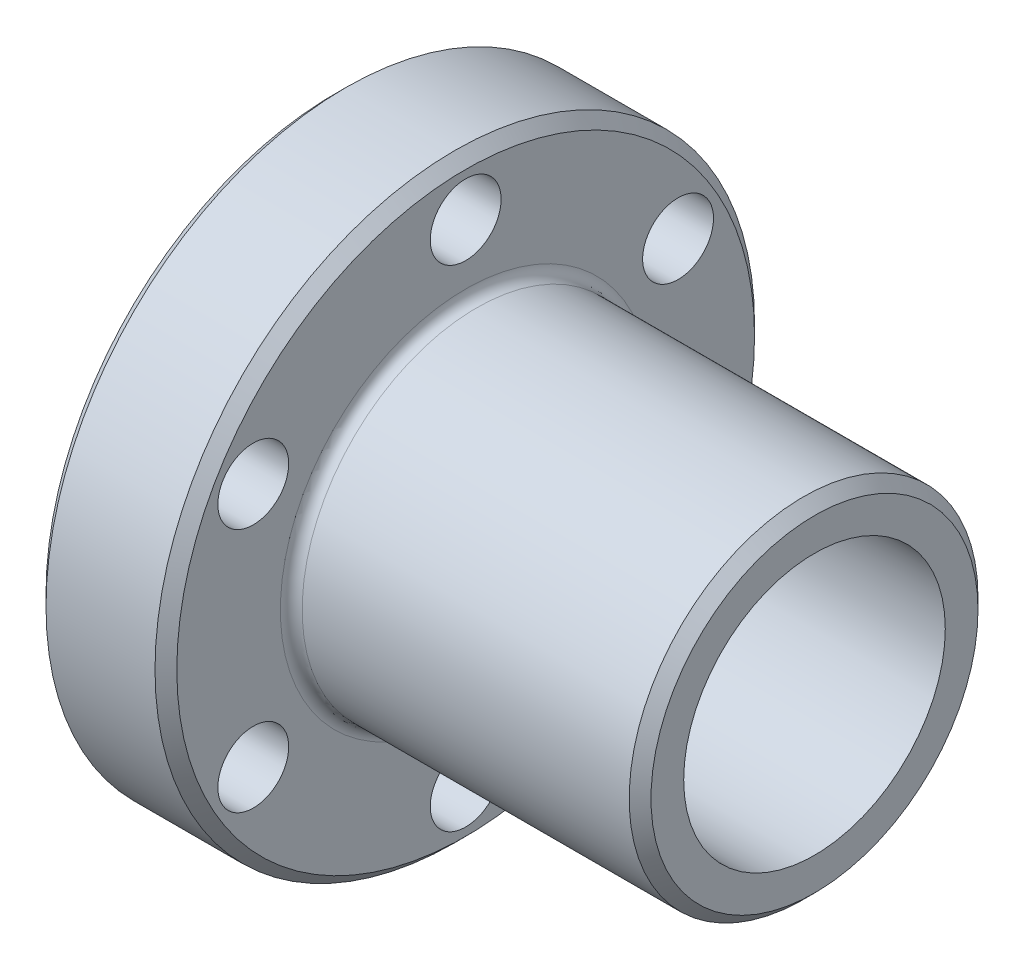
ISO-10303-21;
HEADER;
FILE_DESCRIPTION(('STEP AP214'),'2;1');
FILE_NAME('part.step','',(''),(''),'','','');
FILE_SCHEMA(('AUTOMOTIVE_DESIGN { 1 0 10303 214 1 1 1 1 }'));
ENDSEC;
DATA;
#1=APPLICATION_CONTEXT('core data for automotive mechanical design processes');
#2=APPLICATION_PROTOCOL_DEFINITION('international standard','automotive_design',2000,#1);
#3=PRODUCT_CONTEXT('',#1,'mechanical');
#4=PRODUCT('Part','Part','',(#3));
#5=PRODUCT_RELATED_PRODUCT_CATEGORY('part','',(#4));
#6=PRODUCT_DEFINITION_FORMATION('','',#4);
#7=PRODUCT_DEFINITION_CONTEXT('part definition',#1,'design');
#8=PRODUCT_DEFINITION('design','',#6,#7);
#9=PRODUCT_DEFINITION_SHAPE('','',#8);
#10=(LENGTH_UNIT() NAMED_UNIT(*) SI_UNIT(.MILLI.,.METRE.));
#11=(NAMED_UNIT(*) PLANE_ANGLE_UNIT() SI_UNIT($,.RADIAN.));
#12=(NAMED_UNIT(*) SI_UNIT($,.STERADIAN.) SOLID_ANGLE_UNIT());
#13=UNCERTAINTY_MEASURE_WITH_UNIT(LENGTH_MEASURE(1.E-05),#10,'distance_accuracy_value','');
#14=(GEOMETRIC_REPRESENTATION_CONTEXT(3) GLOBAL_UNCERTAINTY_ASSIGNED_CONTEXT((#13)) GLOBAL_UNIT_ASSIGNED_CONTEXT((#10,
#11,#12)) REPRESENTATION_CONTEXT('',''));
#15=CARTESIAN_POINT('',(0.,0.,0.));
#16=DIRECTION('',(0.,0.,1.));
#17=DIRECTION('',(1.,0.,0.));
#18=AXIS2_PLACEMENT_3D('',#15,#16,#17);
#19=CARTESIAN_POINT('',(1.,0.,0.));
#20=DIRECTION('',(1.,0.,0.));
#21=DIRECTION('',(0.,0.,-1.));
#22=AXIS2_PLACEMENT_3D('',#19,#20,#21);
#23=CONICAL_SURFACE('',#22,27.5,0.785398163397448);
#24=CARTESIAN_POINT('',(0.,0.,0.));
#25=DIRECTION('',(1.,0.,0.));
#26=DIRECTION('',(0.,0.,-1.));
#27=AXIS2_PLACEMENT_3D('',#24,#25,#26);
#28=CIRCLE('',#27,26.5);
#29=CARTESIAN_POINT('',(0.,0.,-26.5));
#30=VERTEX_POINT('',#29);
#31=EDGE_CURVE('E108',#30,#30,#28,.T.);
#32=ORIENTED_EDGE('',*,*,#31,.T.);
#33=EDGE_LOOP('',(#32));
#34=FACE_BOUND('',#33,.T.);
#35=CARTESIAN_POINT('',(1.,0.,0.));
#36=DIRECTION('',(1.,0.,0.));
#37=DIRECTION('',(0.,0.,-1.));
#38=AXIS2_PLACEMENT_3D('',#35,#36,#37);
#39=CIRCLE('',#38,27.5);
#40=CARTESIAN_POINT('',(1.,0.,-27.5));
#41=VERTEX_POINT('',#40);
#42=EDGE_CURVE('E104',#41,#41,#39,.T.);
#43=ORIENTED_EDGE('',*,*,#42,.F.);
#44=EDGE_LOOP('',(#43));
#45=FACE_BOUND('',#44,.T.);
#46=ADVANCED_FACE('F15',(#34,#45),#23,.T.);
#47=CARTESIAN_POINT('',(0.,26.5,0.));
#48=DIRECTION('',(-1.,0.,0.));
#49=DIRECTION('',(0.,0.,1.));
#50=AXIS2_PLACEMENT_3D('',#47,#48,#49);
#51=PLANE('',#50);
#52=CARTESIAN_POINT('',(0.,0.,0.));
#53=DIRECTION('',(1.,0.,0.));
#54=DIRECTION('',(0.,0.,-1.));
#55=AXIS2_PLACEMENT_3D('',#52,#53,#54);
#56=CIRCLE('',#55,12.);
#57=CARTESIAN_POINT('',(0.,0.,-12.));
#58=VERTEX_POINT('',#57);
#59=EDGE_CURVE('E100',#58,#58,#56,.T.);
#60=ORIENTED_EDGE('',*,*,#59,.T.);
#61=EDGE_LOOP('',(#60));
#62=FACE_BOUND('',#61,.T.);
#63=CARTESIAN_POINT('',(0.,22.5,0.));
#64=DIRECTION('',(1.,0.,0.));
#65=DIRECTION('',(0.,0.,-1.));
#66=AXIS2_PLACEMENT_3D('',#63,#64,#65);
#67=CIRCLE('',#66,3.25);
#68=CARTESIAN_POINT('',(0.,22.5,-3.25));
#69=VERTEX_POINT('',#68);
#70=EDGE_CURVE('E96',#69,#69,#67,.T.);
#71=ORIENTED_EDGE('',*,*,#70,.T.);
#72=EDGE_LOOP('',(#71));
#73=FACE_BOUND('',#72,.T.);
#74=CARTESIAN_POINT('',(0.,-11.25,-19.48557158515));
#75=DIRECTION('',(1.,0.,0.));
#76=DIRECTION('',(0.,0.,-1.));
#77=AXIS2_PLACEMENT_3D('',#74,#75,#76);
#78=CIRCLE('',#77,3.25);
#79=CARTESIAN_POINT('',(0.,-11.25,-22.73557158515));
#80=VERTEX_POINT('',#79);
#81=EDGE_CURVE('E92',#80,#80,#78,.T.);
#82=ORIENTED_EDGE('',*,*,#81,.T.);
#83=EDGE_LOOP('',(#82));
#84=FACE_BOUND('',#83,.T.);
#85=CARTESIAN_POINT('',(0.,-22.5,0.));
#86=DIRECTION('',(1.,0.,0.));
#87=DIRECTION('',(0.,0.,-1.));
#88=AXIS2_PLACEMENT_3D('',#85,#86,#87);
#89=CIRCLE('',#88,3.25);
#90=CARTESIAN_POINT('',(0.,-22.5,-3.25));
#91=VERTEX_POINT('',#90);
#92=EDGE_CURVE('E88',#91,#91,#89,.T.);
#93=ORIENTED_EDGE('',*,*,#92,.T.);
#94=EDGE_LOOP('',(#93));
#95=FACE_BOUND('',#94,.T.);
#96=CARTESIAN_POINT('',(0.,-11.25,19.48557158515));
#97=DIRECTION('',(1.,0.,0.));
#98=DIRECTION('',(0.,0.,-1.));
#99=AXIS2_PLACEMENT_3D('',#96,#97,#98);
#100=CIRCLE('',#99,3.25);
#101=CARTESIAN_POINT('',(0.,-11.25,16.23557158515));
#102=VERTEX_POINT('',#101);
#103=EDGE_CURVE('E84',#102,#102,#100,.T.);
#104=ORIENTED_EDGE('',*,*,#103,.T.);
#105=EDGE_LOOP('',(#104));
#106=FACE_BOUND('',#105,.T.);
#107=CARTESIAN_POINT('',(0.,11.25,19.48557158515));
#108=DIRECTION('',(1.,0.,0.));
#109=DIRECTION('',(0.,0.,-1.));
#110=AXIS2_PLACEMENT_3D('',#107,#108,#109);
#111=CIRCLE('',#110,3.25);
#112=CARTESIAN_POINT('',(0.,11.25,16.23557158515));
#113=VERTEX_POINT('',#112);
#114=EDGE_CURVE('E80',#113,#113,#111,.T.);
#115=ORIENTED_EDGE('',*,*,#114,.T.);
#116=EDGE_LOOP('',(#115));
#117=FACE_BOUND('',#116,.T.);
#118=CARTESIAN_POINT('',(0.,11.25,-19.48557158515));
#119=DIRECTION('',(1.,0.,0.));
#120=DIRECTION('',(0.,0.,-1.));
#121=AXIS2_PLACEMENT_3D('',#118,#119,#120);
#122=CIRCLE('',#121,3.25);
#123=CARTESIAN_POINT('',(0.,11.25,-22.73557158515));
#124=VERTEX_POINT('',#123);
#125=EDGE_CURVE('E76',#124,#124,#122,.T.);
#126=ORIENTED_EDGE('',*,*,#125,.T.);
#127=EDGE_LOOP('',(#126));
#128=FACE_BOUND('',#127,.T.);
#129=ORIENTED_EDGE('',*,*,#31,.F.);
#130=EDGE_LOOP('',(#129));
#131=FACE_BOUND('',#130,.T.);
#132=ADVANCED_FACE('F115',(#62,#73,#84,#95,#106,#117,#128,#131),#51,.T.);
#133=CARTESIAN_POINT('',(44.,0.,0.));
#134=DIRECTION('',(1.,0.,0.));
#135=DIRECTION('',(0.,0.,-1.));
#136=AXIS2_PLACEMENT_3D('',#133,#134,#135);
#137=CYLINDRICAL_SURFACE('',#136,27.5);
#138=ORIENTED_EDGE('',*,*,#42,.T.);
#139=EDGE_LOOP('',(#138));
#140=FACE_BOUND('',#139,.T.);
#141=CARTESIAN_POINT('',(11.,0.,0.));
#142=DIRECTION('',(1.,0.,0.));
#143=DIRECTION('',(0.,0.,-1.));
#144=AXIS2_PLACEMENT_3D('',#141,#142,#143);
#145=CIRCLE('',#144,27.5);
#146=CARTESIAN_POINT('',(11.,0.,-27.5));
#147=VERTEX_POINT('',#146);
#148=EDGE_CURVE('E72',#147,#147,#145,.T.);
#149=ORIENTED_EDGE('',*,*,#148,.F.);
#150=EDGE_LOOP('',(#149));
#151=FACE_BOUND('',#150,.T.);
#152=ADVANCED_FACE('F117',(#140,#151),#137,.T.);
#153=CARTESIAN_POINT('',(44.,0.,0.));
#154=DIRECTION('',(1.,0.,0.));
#155=DIRECTION('',(0.,0.,-1.));
#156=AXIS2_PLACEMENT_3D('',#153,#154,#155);
#157=CYLINDRICAL_SURFACE('',#156,12.);
#158=CARTESIAN_POINT('',(44.,0.,0.));
#159=DIRECTION('',(1.,0.,0.));
#160=DIRECTION('',(0.,0.,-1.));
#161=AXIS2_PLACEMENT_3D('',#158,#159,#160);
#162=CIRCLE('',#161,12.);
#163=CARTESIAN_POINT('',(44.,0.,-12.));
#164=VERTEX_POINT('',#163);
#165=EDGE_CURVE('E68',#164,#164,#162,.T.);
#166=ORIENTED_EDGE('',*,*,#165,.T.);
#167=EDGE_LOOP('',(#166));
#168=FACE_BOUND('',#167,.T.);
#169=ORIENTED_EDGE('',*,*,#59,.F.);
#170=EDGE_LOOP('',(#169));
#171=FACE_BOUND('',#170,.T.);
#172=ADVANCED_FACE('F125',(#168,#171),#157,.F.);
#173=CARTESIAN_POINT('',(12.,22.5,0.));
#174=DIRECTION('',(-1.,0.,0.));
#175=DIRECTION('',(0.,0.,1.));
#176=AXIS2_PLACEMENT_3D('',#173,#174,#175);
#177=CYLINDRICAL_SURFACE('',#176,3.25);
#178=CARTESIAN_POINT('',(12.,22.5,0.));
#179=DIRECTION('',(-1.,0.,0.));
#180=DIRECTION('',(0.,0.,-1.));
#181=AXIS2_PLACEMENT_3D('',#178,#179,#180);
#182=CIRCLE('',#181,3.25);
#183=CARTESIAN_POINT('',(12.,22.5,-3.25));
#184=VERTEX_POINT('',#183);
#185=EDGE_CURVE('E64',#184,#184,#182,.T.);
#186=ORIENTED_EDGE('',*,*,#185,.F.);
#187=EDGE_LOOP('',(#186));
#188=FACE_BOUND('',#187,.T.);
#189=ORIENTED_EDGE('',*,*,#70,.F.);
#190=EDGE_LOOP('',(#189));
#191=FACE_BOUND('',#190,.T.);
#192=ADVANCED_FACE('F133',(#188,#191),#177,.F.);
#193=CARTESIAN_POINT('',(12.,-11.25,-19.48557158515));
#194=DIRECTION('',(-1.,0.,0.));
#195=DIRECTION('',(0.,0.,1.));
#196=AXIS2_PLACEMENT_3D('',#193,#194,#195);
#197=CYLINDRICAL_SURFACE('',#196,3.25);
#198=CARTESIAN_POINT('',(12.,-11.25,-19.48557158515));
#199=DIRECTION('',(1.,0.,0.));
#200=DIRECTION('',(0.,0.,-1.));
#201=AXIS2_PLACEMENT_3D('',#198,#199,#200);
#202=CIRCLE('',#201,3.25);
#203=CARTESIAN_POINT('',(12.,-11.25,-22.73557158515));
#204=VERTEX_POINT('',#203);
#205=EDGE_CURVE('E60',#204,#204,#202,.T.);
#206=ORIENTED_EDGE('',*,*,#205,.T.);
#207=EDGE_LOOP('',(#206));
#208=FACE_BOUND('',#207,.T.);
#209=ORIENTED_EDGE('',*,*,#81,.F.);
#210=EDGE_LOOP('',(#209));
#211=FACE_BOUND('',#210,.T.);
#212=ADVANCED_FACE('F137',(#208,#211),#197,.F.);
#213=CARTESIAN_POINT('',(12.,-22.5,0.));
#214=DIRECTION('',(-1.,0.,0.));
#215=DIRECTION('',(0.,0.,1.));
#216=AXIS2_PLACEMENT_3D('',#213,#214,#215);
#217=CYLINDRICAL_SURFACE('',#216,3.25);
#218=CARTESIAN_POINT('',(12.,-22.5,0.));
#219=DIRECTION('',(1.,0.,0.));
#220=DIRECTION('',(0.,0.,-1.));
#221=AXIS2_PLACEMENT_3D('',#218,#219,#220);
#222=CIRCLE('',#221,3.25);
#223=CARTESIAN_POINT('',(12.,-22.5,-3.25));
#224=VERTEX_POINT('',#223);
#225=EDGE_CURVE('E56',#224,#224,#222,.T.);
#226=ORIENTED_EDGE('',*,*,#225,.T.);
#227=EDGE_LOOP('',(#226));
#228=FACE_BOUND('',#227,.T.);
#229=ORIENTED_EDGE('',*,*,#92,.F.);
#230=EDGE_LOOP('',(#229));
#231=FACE_BOUND('',#230,.T.);
#232=ADVANCED_FACE('F141',(#228,#231),#217,.F.);
#233=CARTESIAN_POINT('',(12.,-11.25,19.48557158515));
#234=DIRECTION('',(-1.,0.,0.));
#235=DIRECTION('',(0.,0.,1.));
#236=AXIS2_PLACEMENT_3D('',#233,#234,#235);
#237=CYLINDRICAL_SURFACE('',#236,3.25);
#238=CARTESIAN_POINT('',(12.,-11.25,19.48557158515));
#239=DIRECTION('',(1.,0.,0.));
#240=DIRECTION('',(0.,0.,-1.));
#241=AXIS2_PLACEMENT_3D('',#238,#239,#240);
#242=CIRCLE('',#241,3.25);
#243=CARTESIAN_POINT('',(12.,-11.25,16.23557158515));
#244=VERTEX_POINT('',#243);
#245=EDGE_CURVE('E52',#244,#244,#242,.T.);
#246=ORIENTED_EDGE('',*,*,#245,.T.);
#247=EDGE_LOOP('',(#246));
#248=FACE_BOUND('',#247,.T.);
#249=ORIENTED_EDGE('',*,*,#103,.F.);
#250=EDGE_LOOP('',(#249));
#251=FACE_BOUND('',#250,.T.);
#252=ADVANCED_FACE('F145',(#248,#251),#237,.F.);
#253=CARTESIAN_POINT('',(12.,11.25,19.48557158515));
#254=DIRECTION('',(-1.,0.,0.));
#255=DIRECTION('',(0.,0.,1.));
#256=AXIS2_PLACEMENT_3D('',#253,#254,#255);
#257=CYLINDRICAL_SURFACE('',#256,3.25);
#258=CARTESIAN_POINT('',(12.,11.25,19.48557158515));
#259=DIRECTION('',(1.,0.,0.));
#260=DIRECTION('',(0.,0.,-1.));
#261=AXIS2_PLACEMENT_3D('',#258,#259,#260);
#262=CIRCLE('',#261,3.25);
#263=CARTESIAN_POINT('',(12.,11.25,16.23557158515));
#264=VERTEX_POINT('',#263);
#265=EDGE_CURVE('E48',#264,#264,#262,.T.);
#266=ORIENTED_EDGE('',*,*,#265,.T.);
#267=EDGE_LOOP('',(#266));
#268=FACE_BOUND('',#267,.T.);
#269=ORIENTED_EDGE('',*,*,#114,.F.);
#270=EDGE_LOOP('',(#269));
#271=FACE_BOUND('',#270,.T.);
#272=ADVANCED_FACE('F149',(#268,#271),#257,.F.);
#273=CARTESIAN_POINT('',(12.,11.25,-19.48557158515));
#274=DIRECTION('',(-1.,0.,0.));
#275=DIRECTION('',(0.,0.,1.));
#276=AXIS2_PLACEMENT_3D('',#273,#274,#275);
#277=CYLINDRICAL_SURFACE('',#276,3.25);
#278=CARTESIAN_POINT('',(12.,11.25,-19.48557158515));
#279=DIRECTION('',(1.,0.,0.));
#280=DIRECTION('',(0.,0.,-1.));
#281=AXIS2_PLACEMENT_3D('',#278,#279,#280);
#282=CIRCLE('',#281,3.25);
#283=CARTESIAN_POINT('',(12.,11.25,-22.73557158515));
#284=VERTEX_POINT('',#283);
#285=EDGE_CURVE('E44',#284,#284,#282,.T.);
#286=ORIENTED_EDGE('',*,*,#285,.T.);
#287=EDGE_LOOP('',(#286));
#288=FACE_BOUND('',#287,.T.);
#289=ORIENTED_EDGE('',*,*,#125,.F.);
#290=EDGE_LOOP('',(#289));
#291=FACE_BOUND('',#290,.T.);
#292=ADVANCED_FACE('F153',(#288,#291),#277,.F.);
#293=CARTESIAN_POINT('',(12.,0.,0.));
#294=DIRECTION('',(-1.,0.,0.));
#295=DIRECTION('',(0.,0.,1.));
#296=AXIS2_PLACEMENT_3D('',#293,#294,#295);
#297=CONICAL_SURFACE('',#296,26.5,0.785398163397448);
#298=ORIENTED_EDGE('',*,*,#148,.T.);
#299=EDGE_LOOP('',(#298));
#300=FACE_BOUND('',#299,.T.);
#301=CARTESIAN_POINT('',(12.,0.,0.));
#302=DIRECTION('',(1.,0.,0.));
#303=DIRECTION('',(0.,0.,-1.));
#304=AXIS2_PLACEMENT_3D('',#301,#302,#303);
#305=CIRCLE('',#304,26.5);
#306=CARTESIAN_POINT('',(12.,0.,-26.5));
#307=VERTEX_POINT('',#306);
#308=EDGE_CURVE('E40',#307,#307,#305,.T.);
#309=ORIENTED_EDGE('',*,*,#308,.F.);
#310=EDGE_LOOP('',(#309));
#311=FACE_BOUND('',#310,.T.);
#312=ADVANCED_FACE('F157',(#300,#311),#297,.T.);
#313=CARTESIAN_POINT('',(44.,12.,0.));
#314=DIRECTION('',(1.,0.,0.));
#315=DIRECTION('',(0.,0.,-1.));
#316=AXIS2_PLACEMENT_3D('',#313,#314,#315);
#317=PLANE('',#316);
#318=CARTESIAN_POINT('',(44.,0.,0.));
#319=DIRECTION('',(1.,0.,0.));
#320=DIRECTION('',(0.,0.,-1.));
#321=AXIS2_PLACEMENT_3D('',#318,#319,#320);
#322=CIRCLE('',#321,15.);
#323=CARTESIAN_POINT('',(44.,0.,-15.));
#324=VERTEX_POINT('',#323);
#325=EDGE_CURVE('E34',#324,#324,#322,.T.);
#326=ORIENTED_EDGE('',*,*,#325,.T.);
#327=EDGE_LOOP('',(#326));
#328=FACE_BOUND('',#327,.T.);
#329=ORIENTED_EDGE('',*,*,#165,.F.);
#330=EDGE_LOOP('',(#329));
#331=FACE_BOUND('',#330,.T.);
#332=ADVANCED_FACE('F161',(#328,#331),#317,.T.);
#333=CARTESIAN_POINT('',(12.,17.,0.));
#334=DIRECTION('',(1.,0.,0.));
#335=DIRECTION('',(0.,0.,-1.));
#336=AXIS2_PLACEMENT_3D('',#333,#334,#335);
#337=PLANE('',#336);
#338=ORIENTED_EDGE('',*,*,#308,.T.);
#339=EDGE_LOOP('',(#338));
#340=FACE_BOUND('',#339,.T.);
#341=ORIENTED_EDGE('',*,*,#185,.T.);
#342=EDGE_LOOP('',(#341));
#343=FACE_BOUND('',#342,.T.);
#344=ORIENTED_EDGE('',*,*,#205,.F.);
#345=EDGE_LOOP('',(#344));
#346=FACE_BOUND('',#345,.T.);
#347=ORIENTED_EDGE('',*,*,#225,.F.);
#348=EDGE_LOOP('',(#347));
#349=FACE_BOUND('',#348,.T.);
#350=ORIENTED_EDGE('',*,*,#245,.F.);
#351=EDGE_LOOP('',(#350));
#352=FACE_BOUND('',#351,.T.);
#353=ORIENTED_EDGE('',*,*,#265,.F.);
#354=EDGE_LOOP('',(#353));
#355=FACE_BOUND('',#354,.T.);
#356=ORIENTED_EDGE('',*,*,#285,.F.);
#357=EDGE_LOOP('',(#356));
#358=FACE_BOUND('',#357,.T.);
#359=CARTESIAN_POINT('',(12.,0.,0.));
#360=DIRECTION('',(1.,0.,0.));
#361=DIRECTION('',(0.,0.,-1.));
#362=AXIS2_PLACEMENT_3D('',#359,#360,#361);
#363=CIRCLE('',#362,17.0000001389872);
#364=CARTESIAN_POINT('',(12.,0.,-17.0000001389872));
#365=VERTEX_POINT('',#364);
#366=EDGE_CURVE('E29',#365,#365,#363,.T.);
#367=ORIENTED_EDGE('',*,*,#366,.F.);
#368=EDGE_LOOP('',(#367));
#369=FACE_BOUND('',#368,.T.);
#370=ADVANCED_FACE('F165',(#340,#343,#346,#349,#352,#355,#358,#369),#337,.T.);
#371=CARTESIAN_POINT('',(44.,0.,0.));
#372=DIRECTION('',(-1.,0.,0.));
#373=DIRECTION('',(0.,0.,1.));
#374=AXIS2_PLACEMENT_3D('',#371,#372,#373);
#375=CONICAL_SURFACE('',#374,15.,0.785398163397452);
#376=CARTESIAN_POINT('',(43.,0.,0.));
#377=DIRECTION('',(1.,0.,0.));
#378=DIRECTION('',(0.,0.,-1.));
#379=AXIS2_PLACEMENT_3D('',#376,#377,#378);
#380=CIRCLE('',#379,16.);
#381=CARTESIAN_POINT('',(43.,0.,-16.));
#382=VERTEX_POINT('',#381);
#383=EDGE_CURVE('E23',#382,#382,#380,.T.);
#384=ORIENTED_EDGE('',*,*,#383,.T.);
#385=EDGE_LOOP('',(#384));
#386=FACE_BOUND('',#385,.T.);
#387=ORIENTED_EDGE('',*,*,#325,.F.);
#388=EDGE_LOOP('',(#387));
#389=FACE_BOUND('',#388,.T.);
#390=ADVANCED_FACE('F169',(#386,#389),#375,.T.);
#391=CARTESIAN_POINT('',(12.9999999999984,0.,0.));
#392=DIRECTION('',(1.,0.,0.));
#393=DIRECTION('',(0.,0.,-1.));
#394=AXIS2_PLACEMENT_3D('',#391,#392,#393);
#395=TOROIDAL_SURFACE('',#394,16.9999999999985,0.99999999999845);
#396=CARTESIAN_POINT('',(13.,0.,0.));
#397=DIRECTION('',(1.,0.,0.));
#398=DIRECTION('',(0.,0.,-1.));
#399=AXIS2_PLACEMENT_3D('',#396,#397,#398);
#400=CIRCLE('',#399,16.);
#401=CARTESIAN_POINT('',(13.,0.,-16.));
#402=VERTEX_POINT('',#401);
#403=EDGE_CURVE('E10',#402,#402,#400,.T.);
#404=ORIENTED_EDGE('',*,*,#403,.F.);
#405=EDGE_LOOP('',(#404));
#406=FACE_BOUND('',#405,.T.);
#407=ORIENTED_EDGE('',*,*,#366,.T.);
#408=EDGE_LOOP('',(#407));
#409=FACE_BOUND('',#408,.T.);
#410=ADVANCED_FACE('F172',(#406,#409),#395,.F.);
#411=CARTESIAN_POINT('',(44.,0.,0.));
#412=DIRECTION('',(1.,0.,0.));
#413=DIRECTION('',(0.,0.,-1.));
#414=AXIS2_PLACEMENT_3D('',#411,#412,#413);
#415=CYLINDRICAL_SURFACE('',#414,16.);
#416=ORIENTED_EDGE('',*,*,#403,.T.);
#417=EDGE_LOOP('',(#416));
#418=FACE_BOUND('',#417,.T.);
#419=ORIENTED_EDGE('',*,*,#383,.F.);
#420=EDGE_LOOP('',(#419));
#421=FACE_BOUND('',#420,.T.);
#422=ADVANCED_FACE('F17',(#418,#421),#415,.T.);
#423=CLOSED_SHELL('',(#46,#132,#152,#172,#192,#212,#232,#252,#272,#292,#312,#332,#370,#390,#410,#422));
#424=MANIFOLD_SOLID_BREP('B1',#423);
#425=ADVANCED_BREP_SHAPE_REPRESENTATION('',(#18,#424),#14);
#426=SHAPE_DEFINITION_REPRESENTATION(#9,#425);
ENDSEC;
END-ISO-10303-21;
